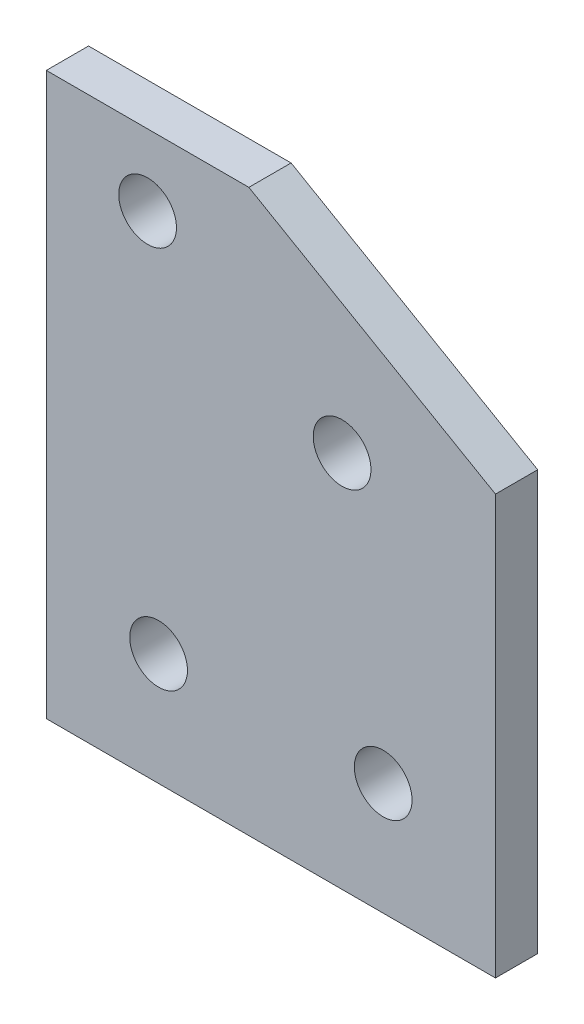
ISO-10303-21;
HEADER;
FILE_DESCRIPTION(('STEP AP214'),'2;1');
FILE_NAME('part.step','',(''),(''),'','','');
FILE_SCHEMA(('AUTOMOTIVE_DESIGN { 1 0 10303 214 1 1 1 1 }'));
ENDSEC;
DATA;
#1=APPLICATION_CONTEXT('core data for automotive mechanical design processes');
#2=APPLICATION_PROTOCOL_DEFINITION('international standard','automotive_design',2000,#1);
#3=PRODUCT_CONTEXT('',#1,'mechanical');
#4=PRODUCT('Part','Part','',(#3));
#5=PRODUCT_RELATED_PRODUCT_CATEGORY('part','',(#4));
#6=PRODUCT_DEFINITION_FORMATION('','',#4);
#7=PRODUCT_DEFINITION_CONTEXT('part definition',#1,'design');
#8=PRODUCT_DEFINITION('design','',#6,#7);
#9=PRODUCT_DEFINITION_SHAPE('','',#8);
#10=(LENGTH_UNIT() NAMED_UNIT(*) SI_UNIT(.MILLI.,.METRE.));
#11=(NAMED_UNIT(*) PLANE_ANGLE_UNIT() SI_UNIT($,.RADIAN.));
#12=(NAMED_UNIT(*) SI_UNIT($,.STERADIAN.) SOLID_ANGLE_UNIT());
#13=UNCERTAINTY_MEASURE_WITH_UNIT(LENGTH_MEASURE(1.E-05),#10,'distance_accuracy_value','');
#14=(GEOMETRIC_REPRESENTATION_CONTEXT(3) GLOBAL_UNCERTAINTY_ASSIGNED_CONTEXT((#13)) GLOBAL_UNIT_ASSIGNED_CONTEXT((#10,
#11,#12)) REPRESENTATION_CONTEXT('',''));
#15=CARTESIAN_POINT('',(0.,0.,0.));
#16=DIRECTION('',(0.,0.,1.));
#17=DIRECTION('',(1.,0.,0.));
#18=AXIS2_PLACEMENT_3D('',#15,#16,#17);
#19=CARTESIAN_POINT('',(0.,0.,2.3876));
#20=DIRECTION('',(0.,0.,1.));
#21=DIRECTION('',(1.,0.,0.));
#22=AXIS2_PLACEMENT_3D('',#19,#20,#21);
#23=PLANE('',#22);
#24=CARTESIAN_POINT('',(-12.7,-19.05,2.3876));
#25=DIRECTION('',(0.,0.,1.));
#26=DIRECTION('',(1.,0.,0.));
#27=AXIS2_PLACEMENT_3D('',#24,#25,#26);
#28=CIRCLE('',#27,3.2639);
#29=CARTESIAN_POINT('',(-9.43609999999999,-19.05,2.3876));
#30=VERTEX_POINT('',#29);
#31=EDGE_CURVE('E132',#30,#30,#28,.T.);
#32=ORIENTED_EDGE('',*,*,#31,.F.);
#33=EDGE_LOOP('',(#32));
#34=FACE_BOUND('',#33,.T.);
#35=CARTESIAN_POINT('',(12.7,-19.05,2.3876));
#36=DIRECTION('',(0.,0.,1.));
#37=DIRECTION('',(1.,0.,0.));
#38=AXIS2_PLACEMENT_3D('',#35,#36,#37);
#39=CIRCLE('',#38,3.2639);
#40=CARTESIAN_POINT('',(15.9639,-19.05,2.3876));
#41=VERTEX_POINT('',#40);
#42=EDGE_CURVE('E140',#41,#41,#39,.T.);
#43=ORIENTED_EDGE('',*,*,#42,.F.);
#44=EDGE_LOOP('',(#43));
#45=FACE_BOUND('',#44,.T.);
#46=DIRECTION('',(1.,0.,0.));
#47=VECTOR('',#46,1.);
#48=CARTESIAN_POINT('',(-25.4,-31.75,2.3876));
#49=LINE('',#48,#47);
#50=CARTESIAN_POINT('',(-25.4,-31.75,2.3876));
#51=VERTEX_POINT('',#50);
#52=CARTESIAN_POINT('',(25.4,-31.75,2.3876));
#53=VERTEX_POINT('',#52);
#54=EDGE_CURVE('E144',#51,#53,#49,.T.);
#55=ORIENTED_EDGE('',*,*,#54,.T.);
#56=DIRECTION('',(0.,1.,0.));
#57=VECTOR('',#56,1.);
#58=CARTESIAN_POINT('',(25.4,-31.75,2.3876));
#59=LINE('',#58,#57);
#60=CARTESIAN_POINT('',(25.4,15.6464,2.3876));
#61=VERTEX_POINT('',#60);
#62=EDGE_CURVE('E92',#53,#61,#59,.T.);
#63=ORIENTED_EDGE('',*,*,#62,.T.);
#64=DIRECTION('',(-0.866001699761409,0.500041054324893,0.));
#65=VECTOR('',#64,1.);
#66=CARTESIAN_POINT('',(25.4,15.6464,2.3876));
#67=LINE('',#66,#65);
#68=CARTESIAN_POINT('',(-2.48920000000001,31.75,2.3876));
#69=VERTEX_POINT('',#68);
#70=EDGE_CURVE('E149',#61,#69,#67,.T.);
#71=ORIENTED_EDGE('',*,*,#70,.T.);
#72=DIRECTION('',(-1.,0.,0.));
#73=VECTOR('',#72,1.);
#74=CARTESIAN_POINT('',(-2.48920000000001,31.75,2.3876));
#75=LINE('',#74,#73);
#76=CARTESIAN_POINT('',(-25.4,31.75,2.3876));
#77=VERTEX_POINT('',#76);
#78=EDGE_CURVE('E62',#69,#77,#75,.T.);
#79=ORIENTED_EDGE('',*,*,#78,.T.);
#80=DIRECTION('',(0.,-1.,0.));
#81=VECTOR('',#80,1.);
#82=CARTESIAN_POINT('',(-25.4,31.75,2.3876));
#83=LINE('',#82,#81);
#84=EDGE_CURVE('E57',#77,#51,#83,.T.);
#85=ORIENTED_EDGE('',*,*,#84,.T.);
#86=EDGE_LOOP('',(#55,#63,#71,#79,#85));
#87=FACE_BOUND('',#86,.T.);
#88=CARTESIAN_POINT('',(8.0521226124509,10.9982,2.3876));
#89=DIRECTION('',(0.,0.,1.));
#90=DIRECTION('',(1.,0.,0.));
#91=AXIS2_PLACEMENT_3D('',#88,#89,#90);
#92=CIRCLE('',#91,3.2639);
#93=CARTESIAN_POINT('',(11.3160226124509,10.9982,2.3876));
#94=VERTEX_POINT('',#93);
#95=EDGE_CURVE('E136',#94,#94,#92,.T.);
#96=ORIENTED_EDGE('',*,*,#95,.F.);
#97=EDGE_LOOP('',(#96));
#98=FACE_BOUND('',#97,.T.);
#99=CARTESIAN_POINT('',(-13.9449226436739,23.6981999999999,2.3876));
#100=DIRECTION('',(0.,0.,1.));
#101=DIRECTION('',(1.,0.,0.));
#102=AXIS2_PLACEMENT_3D('',#99,#100,#101);
#103=CIRCLE('',#102,3.2639);
#104=CARTESIAN_POINT('',(-10.6810226436739,23.6981999999999,2.3876));
#105=VERTEX_POINT('',#104);
#106=EDGE_CURVE('E128',#105,#105,#103,.T.);
#107=ORIENTED_EDGE('',*,*,#106,.F.);
#108=EDGE_LOOP('',(#107));
#109=FACE_BOUND('',#108,.T.);
#110=ADVANCED_FACE('F41',(#34,#45,#87,#98,#109),#23,.T.);
#111=CARTESIAN_POINT('',(-25.4,-31.75,2.3876));
#112=DIRECTION('',(0.,1.,0.));
#113=DIRECTION('',(0.,0.,1.));
#114=AXIS2_PLACEMENT_3D('',#111,#112,#113);
#115=PLANE('',#114);
#116=DIRECTION('',(0.,0.,-1.));
#117=VECTOR('',#116,1.);
#118=CARTESIAN_POINT('',(-25.4,-31.75,2.3876));
#119=LINE('',#118,#117);
#120=CARTESIAN_POINT('',(-25.4,-31.75,-2.3876));
#121=VERTEX_POINT('',#120);
#122=EDGE_CURVE('E108',#51,#121,#119,.T.);
#123=ORIENTED_EDGE('',*,*,#122,.T.);
#124=DIRECTION('',(1.,0.,0.));
#125=VECTOR('',#124,1.);
#126=CARTESIAN_POINT('',(-25.4,-31.75,-2.3876));
#127=LINE('',#126,#125);
#128=CARTESIAN_POINT('',(25.4,-31.75,-2.3876));
#129=VERTEX_POINT('',#128);
#130=EDGE_CURVE('E101',#121,#129,#127,.T.);
#131=ORIENTED_EDGE('',*,*,#130,.T.);
#132=DIRECTION('',(0.,0.,-1.));
#133=VECTOR('',#132,1.);
#134=CARTESIAN_POINT('',(25.4,-31.75,2.3876));
#135=LINE('',#134,#133);
#136=EDGE_CURVE('E11',#53,#129,#135,.T.);
#137=ORIENTED_EDGE('',*,*,#136,.F.);
#138=ORIENTED_EDGE('',*,*,#54,.F.);
#139=EDGE_LOOP('',(#123,#131,#137,#138));
#140=FACE_BOUND('',#139,.T.);
#141=ADVANCED_FACE('F43',(#140),#115,.F.);
#142=CARTESIAN_POINT('',(25.4,-31.75,2.3876));
#143=DIRECTION('',(-1.,0.,0.));
#144=DIRECTION('',(0.,0.,1.));
#145=AXIS2_PLACEMENT_3D('',#142,#143,#144);
#146=PLANE('',#145);
#147=ORIENTED_EDGE('',*,*,#136,.T.);
#148=DIRECTION('',(0.,1.,0.));
#149=VECTOR('',#148,1.);
#150=CARTESIAN_POINT('',(25.4,-31.75,-2.3876));
#151=LINE('',#150,#149);
#152=CARTESIAN_POINT('',(25.4,15.6464,-2.3876));
#153=VERTEX_POINT('',#152);
#154=EDGE_CURVE('E91',#129,#153,#151,.T.);
#155=ORIENTED_EDGE('',*,*,#154,.T.);
#156=DIRECTION('',(0.,0.,-1.));
#157=VECTOR('',#156,1.);
#158=CARTESIAN_POINT('',(25.4,15.6464,2.3876));
#159=LINE('',#158,#157);
#160=EDGE_CURVE('E50',#61,#153,#159,.T.);
#161=ORIENTED_EDGE('',*,*,#160,.F.);
#162=ORIENTED_EDGE('',*,*,#62,.F.);
#163=EDGE_LOOP('',(#147,#155,#161,#162));
#164=FACE_BOUND('',#163,.T.);
#165=ADVANCED_FACE('F89',(#164),#146,.F.);
#166=CARTESIAN_POINT('',(25.4,15.6464,2.3876));
#167=DIRECTION('',(-0.500041054324893,-0.866001699761409,0.));
#168=DIRECTION('',(0.866001699761409,-0.500041054324893,0.));
#169=AXIS2_PLACEMENT_3D('',#166,#167,#168);
#170=PLANE('',#169);
#171=ORIENTED_EDGE('',*,*,#160,.T.);
#172=DIRECTION('',(-0.866001699761409,0.500041054324893,0.));
#173=VECTOR('',#172,1.);
#174=CARTESIAN_POINT('',(25.4,15.6464,-2.3876));
#175=LINE('',#174,#173);
#176=CARTESIAN_POINT('',(-2.48920000000001,31.75,-2.3876));
#177=VERTEX_POINT('',#176);
#178=EDGE_CURVE('E105',#153,#177,#175,.T.);
#179=ORIENTED_EDGE('',*,*,#178,.T.);
#180=DIRECTION('',(0.,0.,-1.));
#181=VECTOR('',#180,1.);
#182=CARTESIAN_POINT('',(-2.48920000000001,31.75,2.3876));
#183=LINE('',#182,#181);
#184=EDGE_CURVE('E161',#69,#177,#183,.T.);
#185=ORIENTED_EDGE('',*,*,#184,.F.);
#186=ORIENTED_EDGE('',*,*,#70,.F.);
#187=EDGE_LOOP('',(#171,#179,#185,#186));
#188=FACE_BOUND('',#187,.T.);
#189=ADVANCED_FACE('F167',(#188),#170,.F.);
#190=CARTESIAN_POINT('',(-2.48920000000001,31.75,2.3876));
#191=DIRECTION('',(0.,-1.,0.));
#192=DIRECTION('',(1.,0.,0.));
#193=AXIS2_PLACEMENT_3D('',#190,#191,#192);
#194=PLANE('',#193);
#195=ORIENTED_EDGE('',*,*,#184,.T.);
#196=DIRECTION('',(-1.,0.,0.));
#197=VECTOR('',#196,1.);
#198=CARTESIAN_POINT('',(-2.48920000000001,31.75,-2.3876));
#199=LINE('',#198,#197);
#200=CARTESIAN_POINT('',(-25.4,31.75,-2.3876));
#201=VERTEX_POINT('',#200);
#202=EDGE_CURVE('E121',#177,#201,#199,.T.);
#203=ORIENTED_EDGE('',*,*,#202,.T.);
#204=DIRECTION('',(0.,0.,-1.));
#205=VECTOR('',#204,1.);
#206=CARTESIAN_POINT('',(-25.4,31.75,2.3876));
#207=LINE('',#206,#205);
#208=EDGE_CURVE('E158',#77,#201,#207,.T.);
#209=ORIENTED_EDGE('',*,*,#208,.F.);
#210=ORIENTED_EDGE('',*,*,#78,.F.);
#211=EDGE_LOOP('',(#195,#203,#209,#210));
#212=FACE_BOUND('',#211,.T.);
#213=ADVANCED_FACE('F217',(#212),#194,.F.);
#214=CARTESIAN_POINT('',(-25.4,31.75,2.3876));
#215=DIRECTION('',(1.,0.,0.));
#216=DIRECTION('',(0.,1.,0.));
#217=AXIS2_PLACEMENT_3D('',#214,#215,#216);
#218=PLANE('',#217);
#219=ORIENTED_EDGE('',*,*,#208,.T.);
#220=DIRECTION('',(0.,-1.,0.));
#221=VECTOR('',#220,1.);
#222=CARTESIAN_POINT('',(-25.4,31.75,-2.3876));
#223=LINE('',#222,#221);
#224=EDGE_CURVE('E125',#201,#121,#223,.T.);
#225=ORIENTED_EDGE('',*,*,#224,.T.);
#226=ORIENTED_EDGE('',*,*,#122,.F.);
#227=ORIENTED_EDGE('',*,*,#84,.F.);
#228=EDGE_LOOP('',(#219,#225,#226,#227));
#229=FACE_BOUND('',#228,.T.);
#230=ADVANCED_FACE('F211',(#229),#218,.F.);
#231=CARTESIAN_POINT('',(12.7,-19.05,2.3876));
#232=DIRECTION('',(0.,0.,-1.));
#233=DIRECTION('',(-1.,0.,0.));
#234=AXIS2_PLACEMENT_3D('',#231,#232,#233);
#235=CYLINDRICAL_SURFACE('',#234,3.2639);
#236=ORIENTED_EDGE('',*,*,#42,.T.);
#237=EDGE_LOOP('',(#236));
#238=FACE_BOUND('',#237,.T.);
#239=CARTESIAN_POINT('',(12.7,-19.05,-2.3876));
#240=DIRECTION('',(0.,0.,1.));
#241=DIRECTION('',(1.,0.,0.));
#242=AXIS2_PLACEMENT_3D('',#239,#240,#241);
#243=CIRCLE('',#242,3.2639);
#244=CARTESIAN_POINT('',(15.9639,-19.05,-2.3876));
#245=VERTEX_POINT('',#244);
#246=EDGE_CURVE('E110',#245,#245,#243,.T.);
#247=ORIENTED_EDGE('',*,*,#246,.F.);
#248=EDGE_LOOP('',(#247));
#249=FACE_BOUND('',#248,.T.);
#250=ADVANCED_FACE('F202',(#238,#249),#235,.F.);
#251=CARTESIAN_POINT('',(8.0521226124509,10.9982,2.3876));
#252=DIRECTION('',(0.,0.,-1.));
#253=DIRECTION('',(-1.,0.,0.));
#254=AXIS2_PLACEMENT_3D('',#251,#252,#253);
#255=CYLINDRICAL_SURFACE('',#254,3.2639);
#256=ORIENTED_EDGE('',*,*,#95,.T.);
#257=EDGE_LOOP('',(#256));
#258=FACE_BOUND('',#257,.T.);
#259=CARTESIAN_POINT('',(8.0521226124509,10.9982,-2.3876));
#260=DIRECTION('',(0.,0.,1.));
#261=DIRECTION('',(1.,0.,0.));
#262=AXIS2_PLACEMENT_3D('',#259,#260,#261);
#263=CIRCLE('',#262,3.2639);
#264=CARTESIAN_POINT('',(11.3160226124509,10.9982,-2.3876));
#265=VERTEX_POINT('',#264);
#266=EDGE_CURVE('E115',#265,#265,#263,.T.);
#267=ORIENTED_EDGE('',*,*,#266,.F.);
#268=EDGE_LOOP('',(#267));
#269=FACE_BOUND('',#268,.T.);
#270=ADVANCED_FACE('F200',(#258,#269),#255,.F.);
#271=CARTESIAN_POINT('',(-12.7,-19.05,2.3876));
#272=DIRECTION('',(0.,0.,-1.));
#273=DIRECTION('',(-1.,0.,0.));
#274=AXIS2_PLACEMENT_3D('',#271,#272,#273);
#275=CYLINDRICAL_SURFACE('',#274,3.2639);
#276=ORIENTED_EDGE('',*,*,#31,.T.);
#277=EDGE_LOOP('',(#276));
#278=FACE_BOUND('',#277,.T.);
#279=CARTESIAN_POINT('',(-12.7,-19.05,-2.3876));
#280=DIRECTION('',(0.,0.,1.));
#281=DIRECTION('',(1.,0.,0.));
#282=AXIS2_PLACEMENT_3D('',#279,#280,#281);
#283=CIRCLE('',#282,3.2639);
#284=CARTESIAN_POINT('',(-9.43609999999999,-19.05,-2.3876));
#285=VERTEX_POINT('',#284);
#286=EDGE_CURVE('E187',#285,#285,#283,.T.);
#287=ORIENTED_EDGE('',*,*,#286,.F.);
#288=EDGE_LOOP('',(#287));
#289=FACE_BOUND('',#288,.T.);
#290=ADVANCED_FACE('F180',(#278,#289),#275,.F.);
#291=CARTESIAN_POINT('',(-13.9449226436739,23.6981999999999,2.3876));
#292=DIRECTION('',(0.,0.,-1.));
#293=DIRECTION('',(-1.,0.,0.));
#294=AXIS2_PLACEMENT_3D('',#291,#292,#293);
#295=CYLINDRICAL_SURFACE('',#294,3.2639);
#296=ORIENTED_EDGE('',*,*,#106,.T.);
#297=EDGE_LOOP('',(#296));
#298=FACE_BOUND('',#297,.T.);
#299=CARTESIAN_POINT('',(-13.9449226436739,23.6981999999999,-2.3876));
#300=DIRECTION('',(0.,0.,1.));
#301=DIRECTION('',(1.,0.,0.));
#302=AXIS2_PLACEMENT_3D('',#299,#300,#301);
#303=CIRCLE('',#302,3.2639);
#304=CARTESIAN_POINT('',(-10.6810226436739,23.6981999999999,-2.3876));
#305=VERTEX_POINT('',#304);
#306=EDGE_CURVE('E184',#305,#305,#303,.T.);
#307=ORIENTED_EDGE('',*,*,#306,.F.);
#308=EDGE_LOOP('',(#307));
#309=FACE_BOUND('',#308,.T.);
#310=ADVANCED_FACE('F177',(#298,#309),#295,.F.);
#311=CARTESIAN_POINT('',(0.,0.,-2.3876));
#312=DIRECTION('',(0.,0.,1.));
#313=DIRECTION('',(1.,0.,0.));
#314=AXIS2_PLACEMENT_3D('',#311,#312,#313);
#315=PLANE('',#314);
#316=ORIENTED_EDGE('',*,*,#306,.T.);
#317=EDGE_LOOP('',(#316));
#318=FACE_BOUND('',#317,.T.);
#319=ORIENTED_EDGE('',*,*,#286,.T.);
#320=EDGE_LOOP('',(#319));
#321=FACE_BOUND('',#320,.T.);
#322=ORIENTED_EDGE('',*,*,#266,.T.);
#323=EDGE_LOOP('',(#322));
#324=FACE_BOUND('',#323,.T.);
#325=ORIENTED_EDGE('',*,*,#246,.T.);
#326=EDGE_LOOP('',(#325));
#327=FACE_BOUND('',#326,.T.);
#328=ORIENTED_EDGE('',*,*,#130,.F.);
#329=ORIENTED_EDGE('',*,*,#224,.F.);
#330=ORIENTED_EDGE('',*,*,#202,.F.);
#331=ORIENTED_EDGE('',*,*,#178,.F.);
#332=ORIENTED_EDGE('',*,*,#154,.F.);
#333=EDGE_LOOP('',(#328,#329,#330,#331,#332));
#334=FACE_BOUND('',#333,.T.);
#335=ADVANCED_FACE('F99',(#318,#321,#324,#327,#334),#315,.F.);
#336=CLOSED_SHELL('',(#110,#141,#165,#189,#213,#230,#250,#270,#290,#310,#335));
#337=MANIFOLD_SOLID_BREP('B2',#336);
#338=ADVANCED_BREP_SHAPE_REPRESENTATION('',(#18,#337),#14);
#339=SHAPE_DEFINITION_REPRESENTATION(#9,#338);
ENDSEC;
END-ISO-10303-21;
